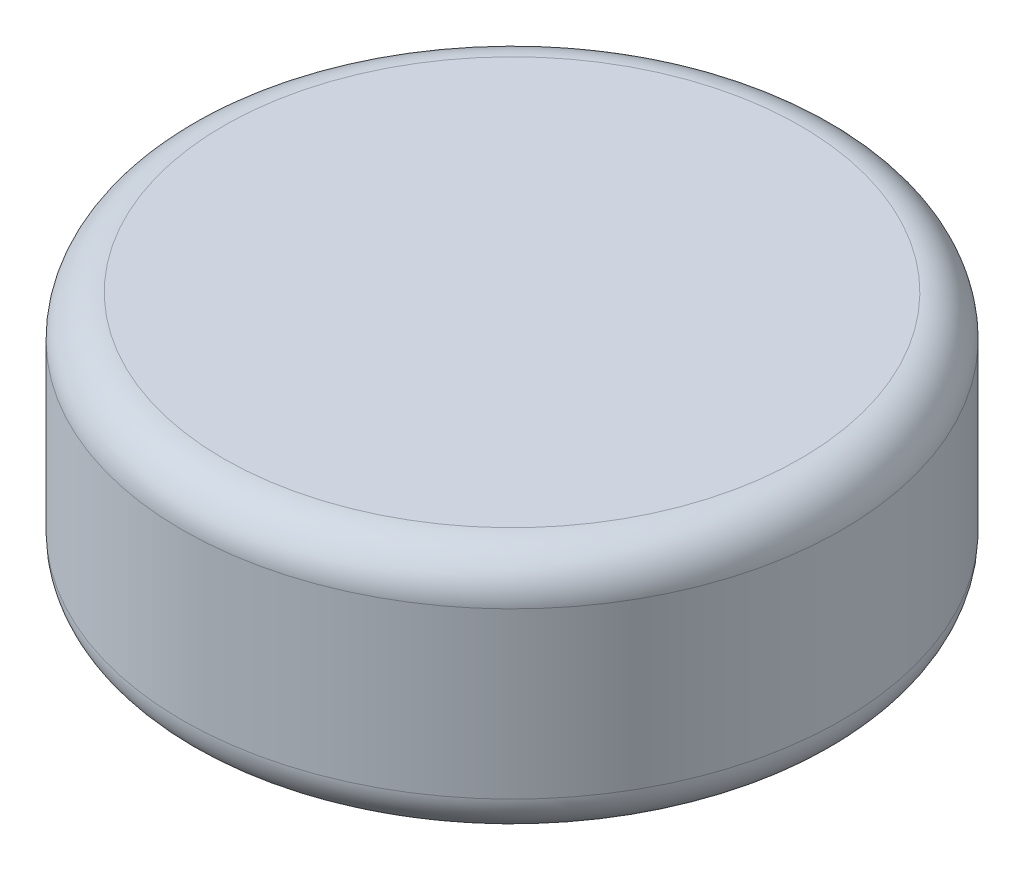
ISO-10303-21;
HEADER;
FILE_DESCRIPTION(('STEP AP214'),'2;1');
FILE_NAME('part.step','',(''),(''),'','','');
FILE_SCHEMA(('AUTOMOTIVE_DESIGN { 1 0 10303 214 1 1 1 1 }'));
ENDSEC;
DATA;
#1=APPLICATION_CONTEXT('core data for automotive mechanical design processes');
#2=APPLICATION_PROTOCOL_DEFINITION('international standard','automotive_design',2000,#1);
#3=PRODUCT_CONTEXT('',#1,'mechanical');
#4=PRODUCT('Part','Part','',(#3));
#5=PRODUCT_RELATED_PRODUCT_CATEGORY('part','',(#4));
#6=PRODUCT_DEFINITION_FORMATION('','',#4);
#7=PRODUCT_DEFINITION_CONTEXT('part definition',#1,'design');
#8=PRODUCT_DEFINITION('design','',#6,#7);
#9=PRODUCT_DEFINITION_SHAPE('','',#8);
#10=(LENGTH_UNIT() NAMED_UNIT(*) SI_UNIT(.MILLI.,.METRE.));
#11=(NAMED_UNIT(*) PLANE_ANGLE_UNIT() SI_UNIT($,.RADIAN.));
#12=(NAMED_UNIT(*) SI_UNIT($,.STERADIAN.) SOLID_ANGLE_UNIT());
#13=UNCERTAINTY_MEASURE_WITH_UNIT(LENGTH_MEASURE(1.E-05),#10,'distance_accuracy_value','');
#14=(GEOMETRIC_REPRESENTATION_CONTEXT(3) GLOBAL_UNCERTAINTY_ASSIGNED_CONTEXT((#13)) GLOBAL_UNIT_ASSIGNED_CONTEXT((#10,
#11,#12)) REPRESENTATION_CONTEXT('',''));
#15=CARTESIAN_POINT('',(0.,0.,0.));
#16=DIRECTION('',(0.,0.,1.));
#17=DIRECTION('',(1.,0.,0.));
#18=AXIS2_PLACEMENT_3D('',#15,#16,#17);
#19=CARTESIAN_POINT('',(0.,3.,0.));
#20=DIRECTION('',(0.,-1.,0.));
#21=DIRECTION('',(0.,0.,-1.));
#22=AXIS2_PLACEMENT_3D('',#19,#20,#21);
#23=CYLINDRICAL_SURFACE('',#22,4.);
#24=CARTESIAN_POINT('',(0.,0.5,0.));
#25=DIRECTION('',(0.,1.,0.));
#26=DIRECTION('',(0.,0.,1.));
#27=AXIS2_PLACEMENT_3D('',#24,#25,#26);
#28=CIRCLE('',#27,4.);
#29=CARTESIAN_POINT('',(0.,0.5,4.));
#30=VERTEX_POINT('',#29);
#31=EDGE_CURVE('E42',#30,#30,#28,.T.);
#32=ORIENTED_EDGE('',*,*,#31,.T.);
#33=EDGE_LOOP('',(#32));
#34=FACE_BOUND('',#33,.T.);
#35=CARTESIAN_POINT('',(0.,2.5,0.));
#36=DIRECTION('',(0.,1.,0.));
#37=DIRECTION('',(0.,0.,1.));
#38=AXIS2_PLACEMENT_3D('',#35,#36,#37);
#39=CIRCLE('',#38,4.);
#40=CARTESIAN_POINT('',(0.,2.5,4.));
#41=VERTEX_POINT('',#40);
#42=EDGE_CURVE('E46',#41,#41,#39,.F.);
#43=ORIENTED_EDGE('',*,*,#42,.T.);
#44=EDGE_LOOP('',(#43));
#45=FACE_BOUND('',#44,.T.);
#46=ADVANCED_FACE('F31',(#34,#45),#23,.T.);
#47=CARTESIAN_POINT('',(0.,3.,0.));
#48=DIRECTION('',(0.,1.,0.));
#49=DIRECTION('',(0.,0.,1.));
#50=AXIS2_PLACEMENT_3D('',#47,#48,#49);
#51=PLANE('',#50);
#52=CARTESIAN_POINT('',(0.,3.,0.));
#53=DIRECTION('',(0.,1.,0.));
#54=DIRECTION('',(0.,0.,1.));
#55=AXIS2_PLACEMENT_3D('',#52,#53,#54);
#56=CIRCLE('',#55,3.5);
#57=CARTESIAN_POINT('',(0.,3.,3.5));
#58=VERTEX_POINT('',#57);
#59=EDGE_CURVE('E10',#58,#58,#56,.T.);
#60=ORIENTED_EDGE('',*,*,#59,.T.);
#61=EDGE_LOOP('',(#60));
#62=FACE_BOUND('',#61,.T.);
#63=ADVANCED_FACE('F62',(#62),#51,.T.);
#64=CARTESIAN_POINT('',(0.,0.,0.));
#65=DIRECTION('',(0.,1.,0.));
#66=DIRECTION('',(0.,0.,1.));
#67=AXIS2_PLACEMENT_3D('',#64,#65,#66);
#68=PLANE('',#67);
#69=CARTESIAN_POINT('',(0.,0.,0.));
#70=DIRECTION('',(0.,1.,0.));
#71=DIRECTION('',(0.,0.,1.));
#72=AXIS2_PLACEMENT_3D('',#69,#70,#71);
#73=CIRCLE('',#72,3.5);
#74=CARTESIAN_POINT('',(0.,0.,3.5));
#75=VERTEX_POINT('',#74);
#76=EDGE_CURVE('E38',#75,#75,#73,.F.);
#77=ORIENTED_EDGE('',*,*,#76,.T.);
#78=EDGE_LOOP('',(#77));
#79=FACE_BOUND('',#78,.T.);
#80=ADVANCED_FACE('F59',(#79),#68,.F.);
#81=CARTESIAN_POINT('',(0.,0.5,0.));
#82=DIRECTION('',(0.,1.,0.));
#83=DIRECTION('',(0.,0.,1.));
#84=AXIS2_PLACEMENT_3D('',#81,#82,#83);
#85=TOROIDAL_SURFACE('',#84,3.5,0.5);
#86=ORIENTED_EDGE('',*,*,#76,.F.);
#87=EDGE_LOOP('',(#86));
#88=FACE_BOUND('',#87,.T.);
#89=ORIENTED_EDGE('',*,*,#31,.F.);
#90=EDGE_LOOP('',(#89));
#91=FACE_BOUND('',#90,.T.);
#92=ADVANCED_FACE('F55',(#88,#91),#85,.T.);
#93=CARTESIAN_POINT('',(0.,2.5,0.));
#94=DIRECTION('',(0.,1.,0.));
#95=DIRECTION('',(0.,0.,1.));
#96=AXIS2_PLACEMENT_3D('',#93,#94,#95);
#97=TOROIDAL_SURFACE('',#96,3.5,0.5);
#98=ORIENTED_EDGE('',*,*,#42,.F.);
#99=EDGE_LOOP('',(#98));
#100=FACE_BOUND('',#99,.T.);
#101=ORIENTED_EDGE('',*,*,#59,.F.);
#102=EDGE_LOOP('',(#101));
#103=FACE_BOUND('',#102,.T.);
#104=ADVANCED_FACE('F33',(#100,#103),#97,.T.);
#105=CLOSED_SHELL('',(#46,#63,#80,#92,#104));
#106=MANIFOLD_SOLID_BREP('B2',#105);
#107=ADVANCED_BREP_SHAPE_REPRESENTATION('',(#18,#106),#14);
#108=SHAPE_DEFINITION_REPRESENTATION(#9,#107);
ENDSEC;
END-ISO-10303-21;
